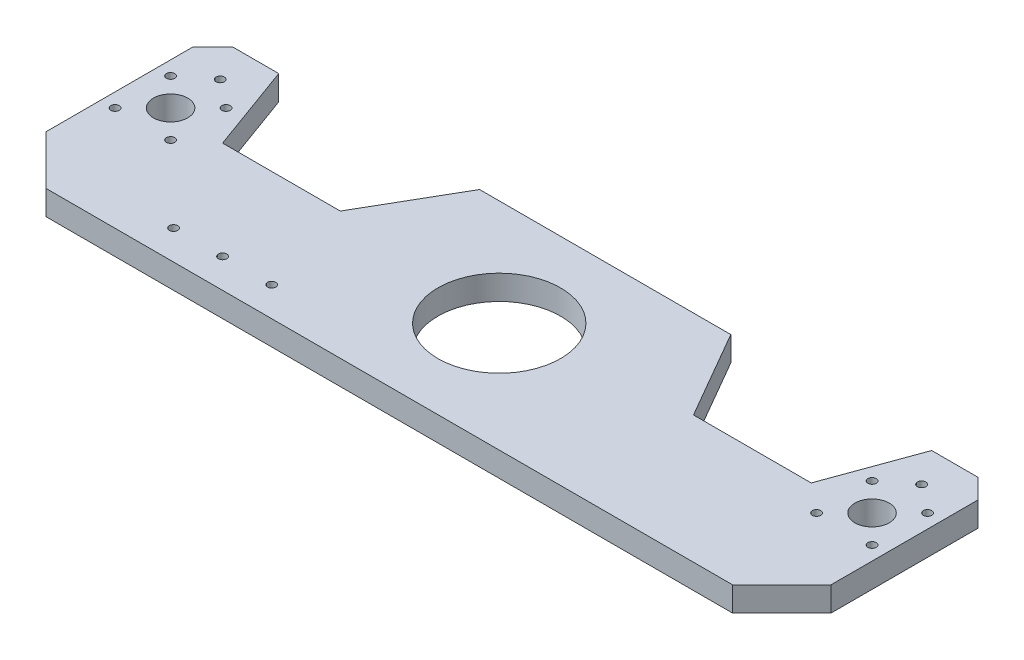
ISO-10303-21;
HEADER;
FILE_DESCRIPTION(('STEP AP214'),'2;1');
FILE_NAME('part.step','',(''),(''),'','','');
FILE_SCHEMA(('AUTOMOTIVE_DESIGN { 1 0 10303 214 1 1 1 1 }'));
ENDSEC;
DATA;
#1=APPLICATION_CONTEXT('core data for automotive mechanical design processes');
#2=APPLICATION_PROTOCOL_DEFINITION('international standard','automotive_design',2000,#1);
#3=PRODUCT_CONTEXT('',#1,'mechanical');
#4=PRODUCT('Part','Part','',(#3));
#5=PRODUCT_RELATED_PRODUCT_CATEGORY('part','',(#4));
#6=PRODUCT_DEFINITION_FORMATION('','',#4);
#7=PRODUCT_DEFINITION_CONTEXT('part definition',#1,'design');
#8=PRODUCT_DEFINITION('design','',#6,#7);
#9=PRODUCT_DEFINITION_SHAPE('','',#8);
#10=(LENGTH_UNIT() NAMED_UNIT(*) SI_UNIT(.MILLI.,.METRE.));
#11=(NAMED_UNIT(*) PLANE_ANGLE_UNIT() SI_UNIT($,.RADIAN.));
#12=(NAMED_UNIT(*) SI_UNIT($,.STERADIAN.) SOLID_ANGLE_UNIT());
#13=UNCERTAINTY_MEASURE_WITH_UNIT(LENGTH_MEASURE(1.E-05),#10,'distance_accuracy_value','');
#14=(GEOMETRIC_REPRESENTATION_CONTEXT(3) GLOBAL_UNCERTAINTY_ASSIGNED_CONTEXT((#13)) GLOBAL_UNIT_ASSIGNED_CONTEXT((#10,
#11,#12)) REPRESENTATION_CONTEXT('',''));
#15=CARTESIAN_POINT('',(0.,0.,0.));
#16=DIRECTION('',(0.,0.,1.));
#17=DIRECTION('',(1.,0.,0.));
#18=AXIS2_PLACEMENT_3D('',#15,#16,#17);
#19=CARTESIAN_POINT('',(-200.,25.,80.));
#20=DIRECTION('',(0.,1.,0.));
#21=DIRECTION('',(0.,0.,1.));
#22=AXIS2_PLACEMENT_3D('',#19,#20,#21);
#23=CYLINDRICAL_SURFACE('',#22,4.25);
#24=CARTESIAN_POINT('',(-200.,0.499999999988177,80.));
#25=DIRECTION('',(0.,1.,0.));
#26=DIRECTION('',(0.,0.,1.));
#27=AXIS2_PLACEMENT_3D('',#24,#25,#26);
#28=CIRCLE('',#27,4.25000000005411);
#29=CARTESIAN_POINT('',(-200.,0.499999999988177,84.2500000000541));
#30=VERTEX_POINT('',#29);
#31=EDGE_CURVE('E174',#30,#30,#28,.F.);
#32=ORIENTED_EDGE('',*,*,#31,.T.);
#33=EDGE_LOOP('',(#32));
#34=FACE_BOUND('',#33,.T.);
#35=CARTESIAN_POINT('',(-200.,25.,80.));
#36=DIRECTION('',(0.,1.,0.));
#37=DIRECTION('',(0.,0.,1.));
#38=AXIS2_PLACEMENT_3D('',#35,#36,#37);
#39=CIRCLE('',#38,4.25);
#40=CARTESIAN_POINT('',(-200.,25.,84.25));
#41=VERTEX_POINT('',#40);
#42=EDGE_CURVE('E20',#41,#41,#39,.T.);
#43=ORIENTED_EDGE('',*,*,#42,.T.);
#44=EDGE_LOOP('',(#43));
#45=FACE_BOUND('',#44,.T.);
#46=ADVANCED_FACE('F17',(#34,#45),#23,.F.);
#47=CARTESIAN_POINT('',(-250.,25.,80.));
#48=DIRECTION('',(0.,1.,0.));
#49=DIRECTION('',(0.,0.,1.));
#50=AXIS2_PLACEMENT_3D('',#47,#48,#49);
#51=CYLINDRICAL_SURFACE('',#50,4.25);
#52=CARTESIAN_POINT('',(-250.,0.499999999988177,80.));
#53=DIRECTION('',(0.,1.,0.));
#54=DIRECTION('',(0.,0.,1.));
#55=AXIS2_PLACEMENT_3D('',#52,#53,#54);
#56=CIRCLE('',#55,4.25000000005411);
#57=CARTESIAN_POINT('',(-250.,0.499999999988177,84.2500000000541));
#58=VERTEX_POINT('',#57);
#59=EDGE_CURVE('E170',#58,#58,#56,.F.);
#60=ORIENTED_EDGE('',*,*,#59,.T.);
#61=EDGE_LOOP('',(#60));
#62=FACE_BOUND('',#61,.T.);
#63=CARTESIAN_POINT('',(-250.,25.,80.));
#64=DIRECTION('',(0.,1.,0.));
#65=DIRECTION('',(0.,0.,1.));
#66=AXIS2_PLACEMENT_3D('',#63,#64,#65);
#67=CIRCLE('',#66,4.25);
#68=CARTESIAN_POINT('',(-250.,25.,84.25));
#69=VERTEX_POINT('',#68);
#70=EDGE_CURVE('E257',#69,#69,#67,.T.);
#71=ORIENTED_EDGE('',*,*,#70,.T.);
#72=EDGE_LOOP('',(#71));
#73=FACE_BOUND('',#72,.T.);
#74=ADVANCED_FACE('F421',(#62,#73),#51,.F.);
#75=CARTESIAN_POINT('',(357.500000705024,25.,-75.));
#76=DIRECTION('',(0.,1.,0.));
#77=DIRECTION('',(0.,0.,1.));
#78=AXIS2_PLACEMENT_3D('',#75,#76,#77);
#79=CYLINDRICAL_SURFACE('',#78,4.25);
#80=CARTESIAN_POINT('',(357.500000705024,0.499999999988177,-75.));
#81=DIRECTION('',(0.,1.,0.));
#82=DIRECTION('',(0.,0.,1.));
#83=AXIS2_PLACEMENT_3D('',#80,#81,#82);
#84=CIRCLE('',#83,4.25000000002457);
#85=CARTESIAN_POINT('',(357.500000705024,0.499999999988177,-70.7499999999754));
#86=VERTEX_POINT('',#85);
#87=EDGE_CURVE('E165',#86,#86,#84,.F.);
#88=ORIENTED_EDGE('',*,*,#87,.T.);
#89=EDGE_LOOP('',(#88));
#90=FACE_BOUND('',#89,.T.);
#91=CARTESIAN_POINT('',(357.500000705024,25.,-75.));
#92=DIRECTION('',(0.,1.,0.));
#93=DIRECTION('',(0.,0.,1.));
#94=AXIS2_PLACEMENT_3D('',#91,#92,#93);
#95=CIRCLE('',#94,4.25);
#96=CARTESIAN_POINT('',(357.500000705024,25.,-70.75));
#97=VERTEX_POINT('',#96);
#98=EDGE_CURVE('E255',#97,#97,#95,.T.);
#99=ORIENTED_EDGE('',*,*,#98,.T.);
#100=EDGE_LOOP('',(#99));
#101=FACE_BOUND('',#100,.T.);
#102=ADVANCED_FACE('F279',(#90,#101),#79,.F.);
#103=CARTESIAN_POINT('',(-357.499999294976,25.,-75.));
#104=DIRECTION('',(0.,1.,0.));
#105=DIRECTION('',(0.,0.,1.));
#106=AXIS2_PLACEMENT_3D('',#103,#104,#105);
#107=CYLINDRICAL_SURFACE('',#106,4.25);
#108=CARTESIAN_POINT('',(-357.499999294976,0.499999999988177,-75.));
#109=DIRECTION('',(0.,1.,0.));
#110=DIRECTION('',(0.,0.,1.));
#111=AXIS2_PLACEMENT_3D('',#108,#109,#110);
#112=CIRCLE('',#111,4.25000000002464);
#113=CARTESIAN_POINT('',(-357.499999294976,0.499999999988177,-70.7499999999754));
#114=VERTEX_POINT('',#113);
#115=EDGE_CURVE('E160',#114,#114,#112,.F.);
#116=ORIENTED_EDGE('',*,*,#115,.T.);
#117=EDGE_LOOP('',(#116));
#118=FACE_BOUND('',#117,.T.);
#119=CARTESIAN_POINT('',(-357.499999294976,25.,-75.));
#120=DIRECTION('',(0.,1.,0.));
#121=DIRECTION('',(0.,0.,1.));
#122=AXIS2_PLACEMENT_3D('',#119,#120,#121);
#123=CIRCLE('',#122,4.25);
#124=CARTESIAN_POINT('',(-357.499999294976,25.,-70.75));
#125=VERTEX_POINT('',#124);
#126=EDGE_CURVE('E252',#125,#125,#123,.T.);
#127=ORIENTED_EDGE('',*,*,#126,.T.);
#128=EDGE_LOOP('',(#127));
#129=FACE_BOUND('',#128,.T.);
#130=ADVANCED_FACE('F267',(#118,#129),#107,.F.);
#131=CARTESIAN_POINT('',(0.,25.,0.));
#132=DIRECTION('',(0.,-1.,0.));
#133=DIRECTION('',(0.,0.,-1.));
#134=AXIS2_PLACEMENT_3D('',#131,#132,#133);
#135=PLANE('',#134);
#136=CARTESIAN_POINT('',(-150.,25.,80.));
#137=DIRECTION('',(0.,1.,0.));
#138=DIRECTION('',(0.,0.,1.));
#139=AXIS2_PLACEMENT_3D('',#136,#137,#138);
#140=CIRCLE('',#139,4.25);
#141=CARTESIAN_POINT('',(-150.,25.,84.25));
#142=VERTEX_POINT('',#141);
#143=EDGE_CURVE('E176',#142,#142,#140,.F.);
#144=ORIENTED_EDGE('',*,*,#143,.T.);
#145=EDGE_LOOP('',(#144));
#146=FACE_BOUND('',#145,.T.);
#147=CARTESIAN_POINT('',(385.784271952485,25.,-52.7842712474622));
#148=DIRECTION('',(0.,1.,0.));
#149=DIRECTION('',(0.,0.,1.));
#150=AXIS2_PLACEMENT_3D('',#147,#148,#149);
#151=CIRCLE('',#150,4.25);
#152=CARTESIAN_POINT('',(385.784271952485,25.,-48.5342712474622));
#153=VERTEX_POINT('',#152);
#154=EDGE_CURVE('E173',#153,#153,#151,.F.);
#155=ORIENTED_EDGE('',*,*,#154,.T.);
#156=EDGE_LOOP('',(#155));
#157=FACE_BOUND('',#156,.T.);
#158=CARTESIAN_POINT('',(329.215729457562,25.,3.78427124746205));
#159=DIRECTION('',(0.,1.,0.));
#160=DIRECTION('',(0.,0.,1.));
#161=AXIS2_PLACEMENT_3D('',#158,#159,#160);
#162=CIRCLE('',#161,4.25);
#163=CARTESIAN_POINT('',(329.215729457562,25.,8.03427124746205));
#164=VERTEX_POINT('',#163);
#165=EDGE_CURVE('E242',#164,#164,#162,.F.);
#166=ORIENTED_EDGE('',*,*,#165,.T.);
#167=EDGE_LOOP('',(#166));
#168=FACE_BOUND('',#167,.T.);
#169=CARTESIAN_POINT('',(-329.215728047514,25.,-52.7842712474623));
#170=DIRECTION('',(0.,1.,0.));
#171=DIRECTION('',(0.,0.,1.));
#172=AXIS2_PLACEMENT_3D('',#169,#170,#171);
#173=CIRCLE('',#172,4.25);
#174=CARTESIAN_POINT('',(-329.215728047514,25.,-48.5342712474623));
#175=VERTEX_POINT('',#174);
#176=EDGE_CURVE('E235',#175,#175,#173,.F.);
#177=ORIENTED_EDGE('',*,*,#176,.T.);
#178=EDGE_LOOP('',(#177));
#179=FACE_BOUND('',#178,.T.);
#180=CARTESIAN_POINT('',(-385.784270542438,25.,3.784271247462));
#181=DIRECTION('',(0.,1.,0.));
#182=DIRECTION('',(0.,0.,1.));
#183=AXIS2_PLACEMENT_3D('',#180,#181,#182);
#184=CIRCLE('',#183,4.25);
#185=CARTESIAN_POINT('',(-385.784270542438,25.,8.034271247462));
#186=VERTEX_POINT('',#185);
#187=EDGE_CURVE('E229',#186,#186,#184,.F.);
#188=ORIENTED_EDGE('',*,*,#187,.T.);
#189=EDGE_LOOP('',(#188));
#190=FACE_BOUND('',#189,.T.);
#191=CARTESIAN_POINT('',(-385.784270542438,25.,-52.7842712474619));
#192=DIRECTION('',(0.,1.,0.));
#193=DIRECTION('',(0.,0.,1.));
#194=AXIS2_PLACEMENT_3D('',#191,#192,#193);
#195=CIRCLE('',#194,4.25);
#196=CARTESIAN_POINT('',(-385.784270542438,25.,-48.5342712474619));
#197=VERTEX_POINT('',#196);
#198=EDGE_CURVE('E164',#197,#197,#195,.F.);
#199=ORIENTED_EDGE('',*,*,#198,.T.);
#200=EDGE_LOOP('',(#199));
#201=FACE_BOUND('',#200,.T.);
#202=ORIENTED_EDGE('',*,*,#126,.F.);
#203=EDGE_LOOP('',(#202));
#204=FACE_BOUND('',#203,.T.);
#205=CARTESIAN_POINT('',(-357.499999294976,25.,-24.5));
#206=DIRECTION('',(0.,1.,0.));
#207=DIRECTION('',(0.,0.,1.));
#208=AXIS2_PLACEMENT_3D('',#205,#206,#207);
#209=CIRCLE('',#208,17.5);
#210=CARTESIAN_POINT('',(-357.499999294976,25.,-7.));
#211=VERTEX_POINT('',#210);
#212=EDGE_CURVE('E163',#211,#211,#209,.F.);
#213=ORIENTED_EDGE('',*,*,#212,.T.);
#214=EDGE_LOOP('',(#213));
#215=FACE_BOUND('',#214,.T.);
#216=CARTESIAN_POINT('',(0.,25.,-2.));
#217=DIRECTION('',(0.,1.,0.));
#218=DIRECTION('',(0.,0.,1.));
#219=AXIS2_PLACEMENT_3D('',#216,#217,#218);
#220=CIRCLE('',#219,62.5);
#221=CARTESIAN_POINT('',(0.,25.,60.5));
#222=VERTEX_POINT('',#221);
#223=EDGE_CURVE('E141',#222,#222,#220,.F.);
#224=ORIENTED_EDGE('',*,*,#223,.T.);
#225=EDGE_LOOP('',(#224));
#226=FACE_BOUND('',#225,.T.);
#227=DIRECTION('',(0.707106781186548,0.,0.707106781186548));
#228=VECTOR('',#227,1.);
#229=CARTESIAN_POINT('',(380.,25.,-110.));
#230=LINE('',#229,#228);
#231=CARTESIAN_POINT('',(400.,25.,-90.));
#232=VERTEX_POINT('',#231);
#233=CARTESIAN_POINT('',(380.,25.,-110.));
#234=VERTEX_POINT('',#233);
#235=EDGE_CURVE('E143',#232,#234,#230,.F.);
#236=ORIENTED_EDGE('',*,*,#235,.T.);
#237=DIRECTION('',(1.,0.,0.));
#238=VECTOR('',#237,1.);
#239=CARTESIAN_POINT('',(-400.,25.,-110.));
#240=LINE('',#239,#238);
#241=CARTESIAN_POINT('',(332.757321083958,25.,-110.));
#242=VERTEX_POINT('',#241);
#243=EDGE_CURVE('E133',#234,#242,#240,.F.);
#244=ORIENTED_EDGE('',*,*,#243,.T.);
#245=DIRECTION('',(0.342020143325665,0.,-0.93969262078591));
#246=VECTOR('',#245,1.);
#247=CARTESIAN_POINT('',(332.757321083958,25.,-110.));
#248=LINE('',#247,#246);
#249=CARTESIAN_POINT('',(300.,25.,-20.));
#250=VERTEX_POINT('',#249);
#251=EDGE_CURVE('E793',#242,#250,#248,.F.);
#252=ORIENTED_EDGE('',*,*,#251,.T.);
#253=DIRECTION('',(1.,0.,0.));
#254=VECTOR('',#253,1.);
#255=CARTESIAN_POINT('',(300.,25.,-20.));
#256=LINE('',#255,#254);
#257=CARTESIAN_POINT('',(180.,25.,-20.));
#258=VERTEX_POINT('',#257);
#259=EDGE_CURVE('E789',#250,#258,#256,.F.);
#260=ORIENTED_EDGE('',*,*,#259,.T.);
#261=DIRECTION('',(0.5,0.,0.86602540378444));
#262=VECTOR('',#261,1.);
#263=CARTESIAN_POINT('',(180.,25.,-19.9999999999993));
#264=LINE('',#263,#262);
#265=CARTESIAN_POINT('',(128.038475772934,25.,-110.));
#266=VERTEX_POINT('',#265);
#267=EDGE_CURVE('E783',#258,#266,#264,.F.);
#268=ORIENTED_EDGE('',*,*,#267,.T.);
#269=DIRECTION('',(1.,0.,0.));
#270=VECTOR('',#269,1.);
#271=CARTESIAN_POINT('',(-400.,25.,-110.));
#272=LINE('',#271,#270);
#273=CARTESIAN_POINT('',(-128.038475772934,25.,-110.));
#274=VERTEX_POINT('',#273);
#275=EDGE_CURVE('E780',#266,#274,#272,.F.);
#276=ORIENTED_EDGE('',*,*,#275,.T.);
#277=DIRECTION('',(0.5,0.,-0.86602540378444));
#278=VECTOR('',#277,1.);
#279=CARTESIAN_POINT('',(-128.038475772934,25.,-110.));
#280=LINE('',#279,#278);
#281=CARTESIAN_POINT('',(-180.,25.,-20.));
#282=VERTEX_POINT('',#281);
#283=EDGE_CURVE('E774',#274,#282,#280,.F.);
#284=ORIENTED_EDGE('',*,*,#283,.T.);
#285=DIRECTION('',(1.,0.,0.));
#286=VECTOR('',#285,1.);
#287=CARTESIAN_POINT('',(-300.,25.,-20.));
#288=LINE('',#287,#286);
#289=CARTESIAN_POINT('',(-300.,25.,-20.));
#290=VERTEX_POINT('',#289);
#291=EDGE_CURVE('E771',#282,#290,#288,.F.);
#292=ORIENTED_EDGE('',*,*,#291,.T.);
#293=DIRECTION('',(0.342020143325665,0.,0.93969262078591));
#294=VECTOR('',#293,1.);
#295=CARTESIAN_POINT('',(-300.,25.,-19.9999999999992));
#296=LINE('',#295,#294);
#297=CARTESIAN_POINT('',(-332.757321083958,25.,-110.));
#298=VERTEX_POINT('',#297);
#299=EDGE_CURVE('E765',#290,#298,#296,.F.);
#300=ORIENTED_EDGE('',*,*,#299,.T.);
#301=DIRECTION('',(1.,0.,0.));
#302=VECTOR('',#301,1.);
#303=CARTESIAN_POINT('',(-400.,25.,-110.));
#304=LINE('',#303,#302);
#305=CARTESIAN_POINT('',(-380.,25.,-110.));
#306=VERTEX_POINT('',#305);
#307=EDGE_CURVE('E761',#298,#306,#304,.F.);
#308=ORIENTED_EDGE('',*,*,#307,.T.);
#309=DIRECTION('',(0.70710678118655,0.,-0.707106781186546));
#310=VECTOR('',#309,1.);
#311=CARTESIAN_POINT('',(-400.,25.,-90.));
#312=LINE('',#311,#310);
#313=CARTESIAN_POINT('',(-400.,25.,-90.));
#314=VERTEX_POINT('',#313);
#315=EDGE_CURVE('E758',#306,#314,#312,.F.);
#316=ORIENTED_EDGE('',*,*,#315,.T.);
#317=DIRECTION('',(0.,0.,-1.));
#318=VECTOR('',#317,1.);
#319=CARTESIAN_POINT('',(-400.,25.,110.));
#320=LINE('',#319,#318);
#321=CARTESIAN_POINT('',(-400.,25.,60.));
#322=VERTEX_POINT('',#321);
#323=EDGE_CURVE('E753',#314,#322,#320,.F.);
#324=ORIENTED_EDGE('',*,*,#323,.T.);
#325=DIRECTION('',(-0.707106781186546,0.,-0.707106781186549));
#326=VECTOR('',#325,1.);
#327=CARTESIAN_POINT('',(-350.,25.,110.));
#328=LINE('',#327,#326);
#329=CARTESIAN_POINT('',(-350.,25.,110.));
#330=VERTEX_POINT('',#329);
#331=EDGE_CURVE('E748',#322,#330,#328,.F.);
#332=ORIENTED_EDGE('',*,*,#331,.T.);
#333=DIRECTION('',(-1.,0.,0.));
#334=VECTOR('',#333,1.);
#335=CARTESIAN_POINT('',(-400.,25.,110.));
#336=LINE('',#335,#334);
#337=CARTESIAN_POINT('',(350.,25.,110.));
#338=VERTEX_POINT('',#337);
#339=EDGE_CURVE('E742',#330,#338,#336,.F.);
#340=ORIENTED_EDGE('',*,*,#339,.T.);
#341=DIRECTION('',(-0.707106781186548,0.,0.707106781186547));
#342=VECTOR('',#341,1.);
#343=CARTESIAN_POINT('',(400.,25.,60.));
#344=LINE('',#343,#342);
#345=CARTESIAN_POINT('',(400.,25.,60.));
#346=VERTEX_POINT('',#345);
#347=EDGE_CURVE('E738',#338,#346,#344,.F.);
#348=ORIENTED_EDGE('',*,*,#347,.T.);
#349=DIRECTION('',(0.,0.,1.));
#350=VECTOR('',#349,1.);
#351=CARTESIAN_POINT('',(400.,25.,110.));
#352=LINE('',#351,#350);
#353=EDGE_CURVE('E128',#346,#232,#352,.F.);
#354=ORIENTED_EDGE('',*,*,#353,.T.);
#355=EDGE_LOOP('',(#236,#244,#252,#260,#268,#276,#284,#292,#300,#308,#316,#324,#332,#340,#348,#354));
#356=FACE_BOUND('',#355,.T.);
#357=CARTESIAN_POINT('',(-329.215728047514,25.,3.78427124746183));
#358=DIRECTION('',(0.,1.,0.));
#359=DIRECTION('',(0.,0.,1.));
#360=AXIS2_PLACEMENT_3D('',#357,#358,#359);
#361=CIRCLE('',#360,4.25);
#362=CARTESIAN_POINT('',(-329.215728047514,25.,8.03427124746183));
#363=VERTEX_POINT('',#362);
#364=EDGE_CURVE('E232',#363,#363,#361,.F.);
#365=ORIENTED_EDGE('',*,*,#364,.T.);
#366=EDGE_LOOP('',(#365));
#367=FACE_BOUND('',#366,.T.);
#368=CARTESIAN_POINT('',(357.500000705024,25.,-24.5));
#369=DIRECTION('',(0.,1.,0.));
#370=DIRECTION('',(0.,0.,1.));
#371=AXIS2_PLACEMENT_3D('',#368,#369,#370);
#372=CIRCLE('',#371,17.5);
#373=CARTESIAN_POINT('',(357.500000705024,25.,-7.));
#374=VERTEX_POINT('',#373);
#375=EDGE_CURVE('E168',#374,#374,#372,.F.);
#376=ORIENTED_EDGE('',*,*,#375,.T.);
#377=EDGE_LOOP('',(#376));
#378=FACE_BOUND('',#377,.T.);
#379=ORIENTED_EDGE('',*,*,#98,.F.);
#380=EDGE_LOOP('',(#379));
#381=FACE_BOUND('',#380,.T.);
#382=CARTESIAN_POINT('',(329.215729457562,25.,-52.7842712474618));
#383=DIRECTION('',(0.,1.,0.));
#384=DIRECTION('',(0.,0.,1.));
#385=AXIS2_PLACEMENT_3D('',#382,#383,#384);
#386=CIRCLE('',#385,4.25);
#387=CARTESIAN_POINT('',(329.215729457562,25.,-48.5342712474618));
#388=VERTEX_POINT('',#387);
#389=EDGE_CURVE('E169',#388,#388,#386,.F.);
#390=ORIENTED_EDGE('',*,*,#389,.T.);
#391=EDGE_LOOP('',(#390));
#392=FACE_BOUND('',#391,.T.);
#393=CARTESIAN_POINT('',(385.784271952486,25.,3.7842712474619));
#394=DIRECTION('',(0.,1.,0.));
#395=DIRECTION('',(0.,0.,1.));
#396=AXIS2_PLACEMENT_3D('',#393,#394,#395);
#397=CIRCLE('',#396,4.25);
#398=CARTESIAN_POINT('',(385.784271952486,25.,8.0342712474619));
#399=VERTEX_POINT('',#398);
#400=EDGE_CURVE('E245',#399,#399,#397,.F.);
#401=ORIENTED_EDGE('',*,*,#400,.T.);
#402=EDGE_LOOP('',(#401));
#403=FACE_BOUND('',#402,.T.);
#404=ORIENTED_EDGE('',*,*,#70,.F.);
#405=EDGE_LOOP('',(#404));
#406=FACE_BOUND('',#405,.T.);
#407=ORIENTED_EDGE('',*,*,#42,.F.);
#408=EDGE_LOOP('',(#407));
#409=FACE_BOUND('',#408,.T.);
#410=ADVANCED_FACE('F144',(#146,#157,#168,#179,#190,#201,#204,#215,#226,#356,#367,#378,#381,
#392,#403,#406,#409),#135,.F.);
#411=CARTESIAN_POINT('',(-150.,25.,80.));
#412=DIRECTION('',(0.,1.,0.));
#413=DIRECTION('',(0.,0.,1.));
#414=AXIS2_PLACEMENT_3D('',#411,#412,#413);
#415=CYLINDRICAL_SURFACE('',#414,4.25);
#416=CARTESIAN_POINT('',(-150.,0.499999999988177,80.));
#417=DIRECTION('',(0.,1.,0.));
#418=DIRECTION('',(0.,0.,1.));
#419=AXIS2_PLACEMENT_3D('',#416,#417,#418);
#420=CIRCLE('',#419,4.25000000005411);
#421=CARTESIAN_POINT('',(-150.,0.499999999988177,84.2500000000541));
#422=VERTEX_POINT('',#421);
#423=EDGE_CURVE('E156',#422,#422,#420,.F.);
#424=ORIENTED_EDGE('',*,*,#423,.T.);
#425=EDGE_LOOP('',(#424));
#426=FACE_BOUND('',#425,.T.);
#427=ORIENTED_EDGE('',*,*,#143,.F.);
#428=EDGE_LOOP('',(#427));
#429=FACE_BOUND('',#428,.T.);
#430=ADVANCED_FACE('F266',(#426,#429),#415,.F.);
#431=CARTESIAN_POINT('',(-200.,0.499999999988177,80.));
#432=DIRECTION('',(0.,1.,0.));
#433=DIRECTION('',(0.,0.,1.));
#434=AXIS2_PLACEMENT_3D('',#431,#432,#433);
#435=CONICAL_SURFACE('',#434,4.25000000005411,1.02974425867589);
#436=CARTESIAN_POINT('',(-200.,-8.14340999147345E-11,80.));
#437=DIRECTION('',(0.,1.,0.));
#438=DIRECTION('',(0.,0.,1.));
#439=AXIS2_PLACEMENT_3D('',#436,#437,#438);
#440=CIRCLE('',#439,3.41786025876445);
#441=CARTESIAN_POINT('',(-200.,-8.14340999147345E-11,83.4178602587644));
#442=VERTEX_POINT('',#441);
#443=EDGE_CURVE('E159',#442,#442,#440,.T.);
#444=ORIENTED_EDGE('',*,*,#443,.F.);
#445=EDGE_LOOP('',(#444));
#446=FACE_BOUND('',#445,.T.);
#447=ORIENTED_EDGE('',*,*,#31,.F.);
#448=EDGE_LOOP('',(#447));
#449=FACE_BOUND('',#448,.T.);
#450=ADVANCED_FACE('F276',(#446,#449),#435,.F.);
#451=CARTESIAN_POINT('',(-250.,0.499999999988177,80.));
#452=DIRECTION('',(0.,1.,0.));
#453=DIRECTION('',(0.,0.,1.));
#454=AXIS2_PLACEMENT_3D('',#451,#452,#453);
#455=CONICAL_SURFACE('',#454,4.25000000005411,1.02974425867589);
#456=CARTESIAN_POINT('',(-250.,-8.14340999147345E-11,80.));
#457=DIRECTION('',(0.,1.,0.));
#458=DIRECTION('',(0.,0.,1.));
#459=AXIS2_PLACEMENT_3D('',#456,#457,#458);
#460=CIRCLE('',#459,3.41786025876445);
#461=CARTESIAN_POINT('',(-250.,-8.14340999147345E-11,83.4178602587644));
#462=VERTEX_POINT('',#461);
#463=EDGE_CURVE('E218',#462,#462,#460,.T.);
#464=ORIENTED_EDGE('',*,*,#463,.F.);
#465=EDGE_LOOP('',(#464));
#466=FACE_BOUND('',#465,.T.);
#467=ORIENTED_EDGE('',*,*,#59,.F.);
#468=EDGE_LOOP('',(#467));
#469=FACE_BOUND('',#468,.T.);
#470=ADVANCED_FACE('F406',(#466,#469),#455,.F.);
#471=CARTESIAN_POINT('',(385.784271952485,25.,-52.7842712474622));
#472=DIRECTION('',(0.,1.,0.));
#473=DIRECTION('',(0.,0.,1.));
#474=AXIS2_PLACEMENT_3D('',#471,#472,#473);
#475=CYLINDRICAL_SURFACE('',#474,4.25);
#476=ORIENTED_EDGE('',*,*,#154,.F.);
#477=EDGE_LOOP('',(#476));
#478=FACE_BOUND('',#477,.T.);
#479=CARTESIAN_POINT('',(385.784271952485,0.,-52.7842712474622));
#480=DIRECTION('',(0.,1.,0.));
#481=DIRECTION('',(0.,0.,1.));
#482=AXIS2_PLACEMENT_3D('',#479,#480,#481);
#483=CIRCLE('',#482,4.25);
#484=CARTESIAN_POINT('',(385.784271952485,0.,-48.5342712474622));
#485=VERTEX_POINT('',#484);
#486=EDGE_CURVE('E215',#485,#485,#483,.T.);
#487=ORIENTED_EDGE('',*,*,#486,.F.);
#488=EDGE_LOOP('',(#487));
#489=FACE_BOUND('',#488,.T.);
#490=ADVANCED_FACE('F402',(#478,#489),#475,.F.);
#491=CARTESIAN_POINT('',(385.784271952486,25.,3.7842712474619));
#492=DIRECTION('',(0.,1.,0.));
#493=DIRECTION('',(0.,0.,1.));
#494=AXIS2_PLACEMENT_3D('',#491,#492,#493);
#495=CYLINDRICAL_SURFACE('',#494,4.25);
#496=ORIENTED_EDGE('',*,*,#400,.F.);
#497=EDGE_LOOP('',(#496));
#498=FACE_BOUND('',#497,.T.);
#499=CARTESIAN_POINT('',(385.784271952486,0.,3.7842712474619));
#500=DIRECTION('',(0.,1.,0.));
#501=DIRECTION('',(0.,0.,1.));
#502=AXIS2_PLACEMENT_3D('',#499,#500,#501);
#503=CIRCLE('',#502,4.25);
#504=CARTESIAN_POINT('',(385.784271952486,0.,8.0342712474619));
#505=VERTEX_POINT('',#504);
#506=EDGE_CURVE('E212',#505,#505,#503,.T.);
#507=ORIENTED_EDGE('',*,*,#506,.F.);
#508=EDGE_LOOP('',(#507));
#509=FACE_BOUND('',#508,.T.);
#510=ADVANCED_FACE('F398',(#498,#509),#495,.F.);
#511=CARTESIAN_POINT('',(329.215729457562,25.,3.78427124746205));
#512=DIRECTION('',(0.,1.,0.));
#513=DIRECTION('',(0.,0.,1.));
#514=AXIS2_PLACEMENT_3D('',#511,#512,#513);
#515=CYLINDRICAL_SURFACE('',#514,4.25);
#516=ORIENTED_EDGE('',*,*,#165,.F.);
#517=EDGE_LOOP('',(#516));
#518=FACE_BOUND('',#517,.T.);
#519=CARTESIAN_POINT('',(329.215729457562,0.,3.78427124746205));
#520=DIRECTION('',(0.,1.,0.));
#521=DIRECTION('',(0.,0.,1.));
#522=AXIS2_PLACEMENT_3D('',#519,#520,#521);
#523=CIRCLE('',#522,4.25);
#524=CARTESIAN_POINT('',(329.215729457562,0.,8.03427124746205));
#525=VERTEX_POINT('',#524);
#526=EDGE_CURVE('E209',#525,#525,#523,.T.);
#527=ORIENTED_EDGE('',*,*,#526,.F.);
#528=EDGE_LOOP('',(#527));
#529=FACE_BOUND('',#528,.T.);
#530=ADVANCED_FACE('F394',(#518,#529),#515,.F.);
#531=CARTESIAN_POINT('',(329.215729457562,25.,-52.7842712474618));
#532=DIRECTION('',(0.,1.,0.));
#533=DIRECTION('',(0.,0.,1.));
#534=AXIS2_PLACEMENT_3D('',#531,#532,#533);
#535=CYLINDRICAL_SURFACE('',#534,4.25);
#536=ORIENTED_EDGE('',*,*,#389,.F.);
#537=EDGE_LOOP('',(#536));
#538=FACE_BOUND('',#537,.T.);
#539=CARTESIAN_POINT('',(329.215729457562,0.,-52.7842712474618));
#540=DIRECTION('',(0.,1.,0.));
#541=DIRECTION('',(0.,0.,1.));
#542=AXIS2_PLACEMENT_3D('',#539,#540,#541);
#543=CIRCLE('',#542,4.25);
#544=CARTESIAN_POINT('',(329.215729457562,0.,-48.5342712474618));
#545=VERTEX_POINT('',#544);
#546=EDGE_CURVE('E206',#545,#545,#543,.T.);
#547=ORIENTED_EDGE('',*,*,#546,.F.);
#548=EDGE_LOOP('',(#547));
#549=FACE_BOUND('',#548,.T.);
#550=ADVANCED_FACE('F390',(#538,#549),#535,.F.);
#551=CARTESIAN_POINT('',(357.500000705024,0.499999999931333,-75.));
#552=DIRECTION('',(0.,1.,0.));
#553=DIRECTION('',(0.,0.,1.));
#554=AXIS2_PLACEMENT_3D('',#551,#552,#553);
#555=CONICAL_SURFACE('',#554,4.24999999991088,1.02974425866576);
#556=CARTESIAN_POINT('',(357.500000705024,4.62889275520961E-12,-75.));
#557=DIRECTION('',(0.,1.,0.));
#558=DIRECTION('',(0.,0.,1.));
#559=AXIS2_PLACEMENT_3D('',#556,#557,#558);
#560=CIRCLE('',#559,3.41786025887814);
#561=CARTESIAN_POINT('',(357.500000705024,4.62889275520961E-12,-71.5821397411219));
#562=VERTEX_POINT('',#561);
#563=EDGE_CURVE('E203',#562,#562,#560,.T.);
#564=ORIENTED_EDGE('',*,*,#563,.F.);
#565=EDGE_LOOP('',(#564));
#566=FACE_BOUND('',#565,.T.);
#567=ORIENTED_EDGE('',*,*,#87,.F.);
#568=EDGE_LOOP('',(#567));
#569=FACE_BOUND('',#568,.T.);
#570=ADVANCED_FACE('F386',(#566,#569),#555,.F.);
#571=CARTESIAN_POINT('',(357.500000705024,0.,-24.5));
#572=DIRECTION('',(0.,1.,0.));
#573=DIRECTION('',(0.,0.,1.));
#574=AXIS2_PLACEMENT_3D('',#571,#572,#573);
#575=CYLINDRICAL_SURFACE('',#574,17.5);
#576=ORIENTED_EDGE('',*,*,#375,.F.);
#577=EDGE_LOOP('',(#576));
#578=FACE_BOUND('',#577,.T.);
#579=CARTESIAN_POINT('',(357.500000705024,0.,-24.5));
#580=DIRECTION('',(0.,1.,0.));
#581=DIRECTION('',(0.,0.,1.));
#582=AXIS2_PLACEMENT_3D('',#579,#580,#581);
#583=CIRCLE('',#582,17.5);
#584=CARTESIAN_POINT('',(357.500000705024,0.,-7.));
#585=VERTEX_POINT('',#584);
#586=EDGE_CURVE('E200',#585,#585,#583,.T.);
#587=ORIENTED_EDGE('',*,*,#586,.F.);
#588=EDGE_LOOP('',(#587));
#589=FACE_BOUND('',#588,.T.);
#590=ADVANCED_FACE('F382',(#578,#589),#575,.F.);
#591=CARTESIAN_POINT('',(-329.215728047514,25.,-52.7842712474623));
#592=DIRECTION('',(0.,1.,0.));
#593=DIRECTION('',(0.,0.,1.));
#594=AXIS2_PLACEMENT_3D('',#591,#592,#593);
#595=CYLINDRICAL_SURFACE('',#594,4.25);
#596=ORIENTED_EDGE('',*,*,#176,.F.);
#597=EDGE_LOOP('',(#596));
#598=FACE_BOUND('',#597,.T.);
#599=CARTESIAN_POINT('',(-329.215728047514,0.,-52.7842712474623));
#600=DIRECTION('',(0.,1.,0.));
#601=DIRECTION('',(0.,0.,1.));
#602=AXIS2_PLACEMENT_3D('',#599,#600,#601);
#603=CIRCLE('',#602,4.25);
#604=CARTESIAN_POINT('',(-329.215728047514,0.,-48.5342712474623));
#605=VERTEX_POINT('',#604);
#606=EDGE_CURVE('E197',#605,#605,#603,.T.);
#607=ORIENTED_EDGE('',*,*,#606,.F.);
#608=EDGE_LOOP('',(#607));
#609=FACE_BOUND('',#608,.T.);
#610=ADVANCED_FACE('F378',(#598,#609),#595,.F.);
#611=CARTESIAN_POINT('',(-329.215728047514,25.,3.78427124746183));
#612=DIRECTION('',(0.,1.,0.));
#613=DIRECTION('',(0.,0.,1.));
#614=AXIS2_PLACEMENT_3D('',#611,#612,#613);
#615=CYLINDRICAL_SURFACE('',#614,4.25);
#616=ORIENTED_EDGE('',*,*,#364,.F.);
#617=EDGE_LOOP('',(#616));
#618=FACE_BOUND('',#617,.T.);
#619=CARTESIAN_POINT('',(-329.215728047514,0.,3.78427124746183));
#620=DIRECTION('',(0.,1.,0.));
#621=DIRECTION('',(0.,0.,1.));
#622=AXIS2_PLACEMENT_3D('',#619,#620,#621);
#623=CIRCLE('',#622,4.25);
#624=CARTESIAN_POINT('',(-329.215728047514,0.,8.03427124746183));
#625=VERTEX_POINT('',#624);
#626=EDGE_CURVE('E194',#625,#625,#623,.T.);
#627=ORIENTED_EDGE('',*,*,#626,.F.);
#628=EDGE_LOOP('',(#627));
#629=FACE_BOUND('',#628,.T.);
#630=ADVANCED_FACE('F374',(#618,#629),#615,.F.);
#631=CARTESIAN_POINT('',(-385.784270542438,25.,3.784271247462));
#632=DIRECTION('',(0.,1.,0.));
#633=DIRECTION('',(0.,0.,1.));
#634=AXIS2_PLACEMENT_3D('',#631,#632,#633);
#635=CYLINDRICAL_SURFACE('',#634,4.25);
#636=ORIENTED_EDGE('',*,*,#187,.F.);
#637=EDGE_LOOP('',(#636));
#638=FACE_BOUND('',#637,.T.);
#639=CARTESIAN_POINT('',(-385.784270542438,0.,3.784271247462));
#640=DIRECTION('',(0.,1.,0.));
#641=DIRECTION('',(0.,0.,1.));
#642=AXIS2_PLACEMENT_3D('',#639,#640,#641);
#643=CIRCLE('',#642,4.25);
#644=CARTESIAN_POINT('',(-385.784270542438,0.,8.034271247462));
#645=VERTEX_POINT('',#644);
#646=EDGE_CURVE('E191',#645,#645,#643,.T.);
#647=ORIENTED_EDGE('',*,*,#646,.F.);
#648=EDGE_LOOP('',(#647));
#649=FACE_BOUND('',#648,.T.);
#650=ADVANCED_FACE('F370',(#638,#649),#635,.F.);
#651=CARTESIAN_POINT('',(-385.784270542438,25.,-52.7842712474619));
#652=DIRECTION('',(0.,1.,0.));
#653=DIRECTION('',(0.,0.,1.));
#654=AXIS2_PLACEMENT_3D('',#651,#652,#653);
#655=CYLINDRICAL_SURFACE('',#654,4.25);
#656=ORIENTED_EDGE('',*,*,#198,.F.);
#657=EDGE_LOOP('',(#656));
#658=FACE_BOUND('',#657,.T.);
#659=CARTESIAN_POINT('',(-385.784270542438,0.,-52.7842712474619));
#660=DIRECTION('',(0.,1.,0.));
#661=DIRECTION('',(0.,0.,1.));
#662=AXIS2_PLACEMENT_3D('',#659,#660,#661);
#663=CIRCLE('',#662,4.25);
#664=CARTESIAN_POINT('',(-385.784270542438,0.,-48.5342712474619));
#665=VERTEX_POINT('',#664);
#666=EDGE_CURVE('E188',#665,#665,#663,.T.);
#667=ORIENTED_EDGE('',*,*,#666,.F.);
#668=EDGE_LOOP('',(#667));
#669=FACE_BOUND('',#668,.T.);
#670=ADVANCED_FACE('F366',(#658,#669),#655,.F.);
#671=CARTESIAN_POINT('',(-357.499999294976,0.499999999931333,-75.));
#672=DIRECTION('',(0.,1.,0.));
#673=DIRECTION('',(0.,0.,1.));
#674=AXIS2_PLACEMENT_3D('',#671,#672,#673);
#675=CONICAL_SURFACE('',#674,4.24999999991095,1.02974425866576);
#676=CARTESIAN_POINT('',(-357.499999294976,4.58715097156892E-12,-75.));
#677=DIRECTION('',(0.,1.,0.));
#678=DIRECTION('',(0.,0.,1.));
#679=AXIS2_PLACEMENT_3D('',#676,#677,#678);
#680=CIRCLE('',#679,3.41786025887814);
#681=CARTESIAN_POINT('',(-357.499999294976,4.58715097156892E-12,-71.5821397411219));
#682=VERTEX_POINT('',#681);
#683=EDGE_CURVE('E185',#682,#682,#680,.T.);
#684=ORIENTED_EDGE('',*,*,#683,.F.);
#685=EDGE_LOOP('',(#684));
#686=FACE_BOUND('',#685,.T.);
#687=ORIENTED_EDGE('',*,*,#115,.F.);
#688=EDGE_LOOP('',(#687));
#689=FACE_BOUND('',#688,.T.);
#690=ADVANCED_FACE('F362',(#686,#689),#675,.F.);
#691=CARTESIAN_POINT('',(-357.499999294976,0.,-24.5));
#692=DIRECTION('',(0.,1.,0.));
#693=DIRECTION('',(0.,0.,1.));
#694=AXIS2_PLACEMENT_3D('',#691,#692,#693);
#695=CYLINDRICAL_SURFACE('',#694,17.5);
#696=ORIENTED_EDGE('',*,*,#212,.F.);
#697=EDGE_LOOP('',(#696));
#698=FACE_BOUND('',#697,.T.);
#699=CARTESIAN_POINT('',(-357.499999294976,0.,-24.5));
#700=DIRECTION('',(0.,1.,0.));
#701=DIRECTION('',(0.,0.,1.));
#702=AXIS2_PLACEMENT_3D('',#699,#700,#701);
#703=CIRCLE('',#702,17.5);
#704=CARTESIAN_POINT('',(-357.499999294976,0.,-7.));
#705=VERTEX_POINT('',#704);
#706=EDGE_CURVE('E182',#705,#705,#703,.T.);
#707=ORIENTED_EDGE('',*,*,#706,.F.);
#708=EDGE_LOOP('',(#707));
#709=FACE_BOUND('',#708,.T.);
#710=ADVANCED_FACE('F358',(#698,#709),#695,.F.);
#711=CARTESIAN_POINT('',(0.,0.,-2.));
#712=DIRECTION('',(0.,1.,0.));
#713=DIRECTION('',(0.,0.,1.));
#714=AXIS2_PLACEMENT_3D('',#711,#712,#713);
#715=CYLINDRICAL_SURFACE('',#714,62.5);
#716=ORIENTED_EDGE('',*,*,#223,.F.);
#717=EDGE_LOOP('',(#716));
#718=FACE_BOUND('',#717,.T.);
#719=CARTESIAN_POINT('',(0.,0.,-2.));
#720=DIRECTION('',(0.,1.,0.));
#721=DIRECTION('',(0.,0.,1.));
#722=AXIS2_PLACEMENT_3D('',#719,#720,#721);
#723=CIRCLE('',#722,62.5);
#724=CARTESIAN_POINT('',(0.,0.,60.5));
#725=VERTEX_POINT('',#724);
#726=EDGE_CURVE('E178',#725,#725,#723,.T.);
#727=ORIENTED_EDGE('',*,*,#726,.F.);
#728=EDGE_LOOP('',(#727));
#729=FACE_BOUND('',#728,.T.);
#730=ADVANCED_FACE('F355',(#718,#729),#715,.F.);
#731=CARTESIAN_POINT('',(-400.,25.,-110.));
#732=DIRECTION('',(0.,0.,1.));
#733=DIRECTION('',(1.,0.,0.));
#734=AXIS2_PLACEMENT_3D('',#731,#732,#733);
#735=PLANE('',#734);
#736=DIRECTION('',(0.,1.,0.));
#737=VECTOR('',#736,1.);
#738=CARTESIAN_POINT('',(380.,25.,-110.));
#739=LINE('',#738,#737);
#740=CARTESIAN_POINT('',(380.,0.,-110.));
#741=VERTEX_POINT('',#740);
#742=EDGE_CURVE('E136',#234,#741,#739,.F.);
#743=ORIENTED_EDGE('',*,*,#742,.T.);
#744=DIRECTION('',(1.,0.,0.));
#745=VECTOR('',#744,1.);
#746=CARTESIAN_POINT('',(0.,0.,-110.));
#747=LINE('',#746,#745);
#748=CARTESIAN_POINT('',(332.757321083958,0.,-110.));
#749=VERTEX_POINT('',#748);
#750=EDGE_CURVE('E181',#749,#741,#747,.T.);
#751=ORIENTED_EDGE('',*,*,#750,.F.);
#752=DIRECTION('',(0.,1.,0.));
#753=VECTOR('',#752,1.);
#754=CARTESIAN_POINT('',(332.757321083958,25.,-110.));
#755=LINE('',#754,#753);
#756=EDGE_CURVE('E139',#749,#242,#755,.T.);
#757=ORIENTED_EDGE('',*,*,#756,.T.);
#758=ORIENTED_EDGE('',*,*,#243,.F.);
#759=EDGE_LOOP('',(#743,#751,#757,#758));
#760=FACE_BOUND('',#759,.T.);
#761=ADVANCED_FACE('F134',(#760),#735,.F.);
#762=CARTESIAN_POINT('',(380.,25.,-110.));
#763=DIRECTION('',(-0.707106781186548,0.,0.707106781186548));
#764=DIRECTION('',(0.707106781186548,0.,0.707106781186548));
#765=AXIS2_PLACEMENT_3D('',#762,#763,#764);
#766=PLANE('',#765);
#767=DIRECTION('',(0.,1.,0.));
#768=VECTOR('',#767,1.);
#769=CARTESIAN_POINT('',(400.,25.,-90.));
#770=LINE('',#769,#768);
#771=CARTESIAN_POINT('',(400.,0.,-90.));
#772=VERTEX_POINT('',#771);
#773=EDGE_CURVE('E733',#232,#772,#770,.F.);
#774=ORIENTED_EDGE('',*,*,#773,.T.);
#775=DIRECTION('',(0.707106781186551,0.,0.707106781186544));
#776=VECTOR('',#775,1.);
#777=CARTESIAN_POINT('',(380.,0.,-110.));
#778=LINE('',#777,#776);
#779=EDGE_CURVE('E151',#741,#772,#778,.T.);
#780=ORIENTED_EDGE('',*,*,#779,.F.);
#781=ORIENTED_EDGE('',*,*,#742,.F.);
#782=ORIENTED_EDGE('',*,*,#235,.F.);
#783=EDGE_LOOP('',(#774,#780,#781,#782));
#784=FACE_BOUND('',#783,.T.);
#785=ADVANCED_FACE('F149',(#784),#766,.F.);
#786=CARTESIAN_POINT('',(400.,25.,110.));
#787=DIRECTION('',(-1.,0.,0.));
#788=DIRECTION('',(0.,0.,1.));
#789=AXIS2_PLACEMENT_3D('',#786,#787,#788);
#790=PLANE('',#789);
#791=ORIENTED_EDGE('',*,*,#773,.F.);
#792=ORIENTED_EDGE('',*,*,#353,.F.);
#793=DIRECTION('',(0.,1.,0.));
#794=VECTOR('',#793,1.);
#795=CARTESIAN_POINT('',(400.,25.,60.));
#796=LINE('',#795,#794);
#797=CARTESIAN_POINT('',(400.,0.,60.));
#798=VERTEX_POINT('',#797);
#799=EDGE_CURVE('E736',#346,#798,#796,.F.);
#800=ORIENTED_EDGE('',*,*,#799,.T.);
#801=DIRECTION('',(0.,0.,-1.));
#802=VECTOR('',#801,1.);
#803=CARTESIAN_POINT('',(400.,0.,0.));
#804=LINE('',#803,#802);
#805=EDGE_CURVE('E735',#772,#798,#804,.F.);
#806=ORIENTED_EDGE('',*,*,#805,.F.);
#807=EDGE_LOOP('',(#791,#792,#800,#806));
#808=FACE_BOUND('',#807,.T.);
#809=ADVANCED_FACE('F346',(#808),#790,.F.);
#810=CARTESIAN_POINT('',(400.,25.,60.));
#811=DIRECTION('',(-0.707106781186547,0.,-0.707106781186548));
#812=DIRECTION('',(-0.707106781186548,0.,0.707106781186547));
#813=AXIS2_PLACEMENT_3D('',#810,#811,#812);
#814=PLANE('',#813);
#815=DIRECTION('',(0.,1.,0.));
#816=VECTOR('',#815,1.);
#817=CARTESIAN_POINT('',(350.,25.,110.));
#818=LINE('',#817,#816);
#819=CARTESIAN_POINT('',(350.,0.,110.));
#820=VERTEX_POINT('',#819);
#821=EDGE_CURVE('E744',#338,#820,#818,.F.);
#822=ORIENTED_EDGE('',*,*,#821,.T.);
#823=DIRECTION('',(-0.707106781186548,0.,0.707106781186547));
#824=VECTOR('',#823,1.);
#825=CARTESIAN_POINT('',(400.,0.,60.));
#826=LINE('',#825,#824);
#827=EDGE_CURVE('E799',#798,#820,#826,.T.);
#828=ORIENTED_EDGE('',*,*,#827,.F.);
#829=ORIENTED_EDGE('',*,*,#799,.F.);
#830=ORIENTED_EDGE('',*,*,#347,.F.);
#831=EDGE_LOOP('',(#822,#828,#829,#830));
#832=FACE_BOUND('',#831,.T.);
#833=ADVANCED_FACE('F342',(#832),#814,.F.);
#834=CARTESIAN_POINT('',(-400.,25.,110.));
#835=DIRECTION('',(0.,0.,-1.));
#836=DIRECTION('',(-1.,0.,0.));
#837=AXIS2_PLACEMENT_3D('',#834,#835,#836);
#838=PLANE('',#837);
#839=ORIENTED_EDGE('',*,*,#821,.F.);
#840=ORIENTED_EDGE('',*,*,#339,.F.);
#841=DIRECTION('',(0.,1.,0.));
#842=VECTOR('',#841,1.);
#843=CARTESIAN_POINT('',(-350.,25.,110.));
#844=LINE('',#843,#842);
#845=CARTESIAN_POINT('',(-350.,0.,110.));
#846=VERTEX_POINT('',#845);
#847=EDGE_CURVE('E746',#330,#846,#844,.F.);
#848=ORIENTED_EDGE('',*,*,#847,.T.);
#849=DIRECTION('',(1.,0.,0.));
#850=VECTOR('',#849,1.);
#851=CARTESIAN_POINT('',(0.,0.,110.));
#852=LINE('',#851,#850);
#853=EDGE_CURVE('E802',#820,#846,#852,.F.);
#854=ORIENTED_EDGE('',*,*,#853,.F.);
#855=EDGE_LOOP('',(#839,#840,#848,#854));
#856=FACE_BOUND('',#855,.T.);
#857=ADVANCED_FACE('F338',(#856),#838,.F.);
#858=CARTESIAN_POINT('',(-350.,25.,110.));
#859=DIRECTION('',(0.707106781186549,0.,-0.707106781186546));
#860=DIRECTION('',(-0.707106781186546,0.,-0.707106781186549));
#861=AXIS2_PLACEMENT_3D('',#858,#859,#860);
#862=PLANE('',#861);
#863=DIRECTION('',(0.,1.,0.));
#864=VECTOR('',#863,1.);
#865=CARTESIAN_POINT('',(-400.,25.,60.));
#866=LINE('',#865,#864);
#867=CARTESIAN_POINT('',(-400.,0.,60.));
#868=VERTEX_POINT('',#867);
#869=EDGE_CURVE('E751',#322,#868,#866,.F.);
#870=ORIENTED_EDGE('',*,*,#869,.T.);
#871=DIRECTION('',(-0.707106781186546,0.,-0.707106781186549));
#872=VECTOR('',#871,1.);
#873=CARTESIAN_POINT('',(-350.,0.,110.));
#874=LINE('',#873,#872);
#875=EDGE_CURVE('E805',#846,#868,#874,.T.);
#876=ORIENTED_EDGE('',*,*,#875,.F.);
#877=ORIENTED_EDGE('',*,*,#847,.F.);
#878=ORIENTED_EDGE('',*,*,#331,.F.);
#879=EDGE_LOOP('',(#870,#876,#877,#878));
#880=FACE_BOUND('',#879,.T.);
#881=ADVANCED_FACE('F334',(#880),#862,.F.);
#882=CARTESIAN_POINT('',(-400.,25.,110.));
#883=DIRECTION('',(1.,0.,0.));
#884=DIRECTION('',(0.,0.,-1.));
#885=AXIS2_PLACEMENT_3D('',#882,#883,#884);
#886=PLANE('',#885);
#887=DIRECTION('',(0.,1.,0.));
#888=VECTOR('',#887,1.);
#889=CARTESIAN_POINT('',(-400.,25.,-90.));
#890=LINE('',#889,#888);
#891=CARTESIAN_POINT('',(-400.,0.,-90.));
#892=VERTEX_POINT('',#891);
#893=EDGE_CURVE('E756',#314,#892,#890,.F.);
#894=ORIENTED_EDGE('',*,*,#893,.T.);
#895=DIRECTION('',(0.,0.,-1.));
#896=VECTOR('',#895,1.);
#897=CARTESIAN_POINT('',(-400.,0.,0.));
#898=LINE('',#897,#896);
#899=EDGE_CURVE('E808',#868,#892,#898,.T.);
#900=ORIENTED_EDGE('',*,*,#899,.F.);
#901=ORIENTED_EDGE('',*,*,#869,.F.);
#902=ORIENTED_EDGE('',*,*,#323,.F.);
#903=EDGE_LOOP('',(#894,#900,#901,#902));
#904=FACE_BOUND('',#903,.T.);
#905=ADVANCED_FACE('F330',(#904),#886,.F.);
#906=CARTESIAN_POINT('',(-400.,25.,-90.));
#907=DIRECTION('',(0.707106781186546,0.,0.70710678118655));
#908=DIRECTION('',(0.70710678118655,0.,-0.707106781186546));
#909=AXIS2_PLACEMENT_3D('',#906,#907,#908);
#910=PLANE('',#909);
#911=DIRECTION('',(0.,1.,0.));
#912=VECTOR('',#911,1.);
#913=CARTESIAN_POINT('',(-380.,25.,-110.));
#914=LINE('',#913,#912);
#915=CARTESIAN_POINT('',(-380.,0.,-110.));
#916=VERTEX_POINT('',#915);
#917=EDGE_CURVE('E763',#306,#916,#914,.F.);
#918=ORIENTED_EDGE('',*,*,#917,.T.);
#919=DIRECTION('',(0.70710678118655,0.,-0.707106781186545));
#920=VECTOR('',#919,1.);
#921=CARTESIAN_POINT('',(-400.,0.,-90.));
#922=LINE('',#921,#920);
#923=EDGE_CURVE('E811',#892,#916,#922,.T.);
#924=ORIENTED_EDGE('',*,*,#923,.F.);
#925=ORIENTED_EDGE('',*,*,#893,.F.);
#926=ORIENTED_EDGE('',*,*,#315,.F.);
#927=EDGE_LOOP('',(#918,#924,#925,#926));
#928=FACE_BOUND('',#927,.T.);
#929=ADVANCED_FACE('F326',(#928),#910,.F.);
#930=CARTESIAN_POINT('',(-400.,25.,-110.));
#931=DIRECTION('',(0.,0.,1.));
#932=DIRECTION('',(1.,0.,0.));
#933=AXIS2_PLACEMENT_3D('',#930,#931,#932);
#934=PLANE('',#933);
#935=ORIENTED_EDGE('',*,*,#917,.F.);
#936=ORIENTED_EDGE('',*,*,#307,.F.);
#937=DIRECTION('',(0.,1.,0.));
#938=VECTOR('',#937,1.);
#939=CARTESIAN_POINT('',(-332.757321083958,0.,-110.));
#940=LINE('',#939,#938);
#941=CARTESIAN_POINT('',(-332.757321083958,0.,-110.));
#942=VERTEX_POINT('',#941);
#943=EDGE_CURVE('E767',#298,#942,#940,.F.);
#944=ORIENTED_EDGE('',*,*,#943,.T.);
#945=DIRECTION('',(1.,0.,0.));
#946=VECTOR('',#945,1.);
#947=CARTESIAN_POINT('',(0.,0.,-110.));
#948=LINE('',#947,#946);
#949=EDGE_CURVE('E814',#916,#942,#948,.T.);
#950=ORIENTED_EDGE('',*,*,#949,.F.);
#951=EDGE_LOOP('',(#935,#936,#944,#950));
#952=FACE_BOUND('',#951,.T.);
#953=ADVANCED_FACE('F322',(#952),#934,.F.);
#954=CARTESIAN_POINT('',(-300.,0.,-19.9999999999992));
#955=DIRECTION('',(-0.93969262078591,0.,0.342020143325665));
#956=DIRECTION('',(0.342020143325665,0.,0.93969262078591));
#957=AXIS2_PLACEMENT_3D('',#954,#955,#956);
#958=PLANE('',#957);
#959=ORIENTED_EDGE('',*,*,#943,.F.);
#960=ORIENTED_EDGE('',*,*,#299,.F.);
#961=DIRECTION('',(0.,1.,0.));
#962=VECTOR('',#961,1.);
#963=CARTESIAN_POINT('',(-300.,0.,-20.));
#964=LINE('',#963,#962);
#965=CARTESIAN_POINT('',(-300.,0.,-20.));
#966=VERTEX_POINT('',#965);
#967=EDGE_CURVE('E769',#290,#966,#964,.F.);
#968=ORIENTED_EDGE('',*,*,#967,.T.);
#969=DIRECTION('',(0.342020143325668,0.,0.939692620785909));
#970=VECTOR('',#969,1.);
#971=CARTESIAN_POINT('',(-332.757321083958,0.,-110.));
#972=LINE('',#971,#970);
#973=EDGE_CURVE('E817',#942,#966,#972,.T.);
#974=ORIENTED_EDGE('',*,*,#973,.F.);
#975=EDGE_LOOP('',(#959,#960,#968,#974));
#976=FACE_BOUND('',#975,.T.);
#977=ADVANCED_FACE('F318',(#976),#958,.F.);
#978=CARTESIAN_POINT('',(-300.,0.,-20.));
#979=DIRECTION('',(0.,0.,1.));
#980=DIRECTION('',(1.,0.,0.));
#981=AXIS2_PLACEMENT_3D('',#978,#979,#980);
#982=PLANE('',#981);
#983=DIRECTION('',(0.,1.,0.));
#984=VECTOR('',#983,1.);
#985=CARTESIAN_POINT('',(-180.,25.,-20.));
#986=LINE('',#985,#984);
#987=CARTESIAN_POINT('',(-180.,0.,-20.));
#988=VERTEX_POINT('',#987);
#989=EDGE_CURVE('E776',#282,#988,#986,.F.);
#990=ORIENTED_EDGE('',*,*,#989,.T.);
#991=DIRECTION('',(1.,0.,0.));
#992=VECTOR('',#991,1.);
#993=CARTESIAN_POINT('',(0.,0.,-20.));
#994=LINE('',#993,#992);
#995=EDGE_CURVE('E820',#966,#988,#994,.T.);
#996=ORIENTED_EDGE('',*,*,#995,.F.);
#997=ORIENTED_EDGE('',*,*,#967,.F.);
#998=ORIENTED_EDGE('',*,*,#291,.F.);
#999=EDGE_LOOP('',(#990,#996,#997,#998));
#1000=FACE_BOUND('',#999,.T.);
#1001=ADVANCED_FACE('F314',(#1000),#982,.F.);
#1002=CARTESIAN_POINT('',(-128.038475772934,25.,-110.));
#1003=DIRECTION('',(0.86602540378444,0.,0.5));
#1004=DIRECTION('',(0.5,0.,-0.86602540378444));
#1005=AXIS2_PLACEMENT_3D('',#1002,#1003,#1004);
#1006=PLANE('',#1005);
#1007=ORIENTED_EDGE('',*,*,#989,.F.);
#1008=ORIENTED_EDGE('',*,*,#283,.F.);
#1009=DIRECTION('',(0.,1.,0.));
#1010=VECTOR('',#1009,1.);
#1011=CARTESIAN_POINT('',(-128.038475772934,25.,-110.));
#1012=LINE('',#1011,#1010);
#1013=CARTESIAN_POINT('',(-128.038475772934,0.,-110.));
#1014=VERTEX_POINT('',#1013);
#1015=EDGE_CURVE('E778',#274,#1014,#1012,.F.);
#1016=ORIENTED_EDGE('',*,*,#1015,.T.);
#1017=DIRECTION('',(0.5,0.,-0.866025403784439));
#1018=VECTOR('',#1017,1.);
#1019=CARTESIAN_POINT('',(-180.,0.,-20.));
#1020=LINE('',#1019,#1018);
#1021=EDGE_CURVE('E823',#988,#1014,#1020,.T.);
#1022=ORIENTED_EDGE('',*,*,#1021,.F.);
#1023=EDGE_LOOP('',(#1007,#1008,#1016,#1022));
#1024=FACE_BOUND('',#1023,.T.);
#1025=ADVANCED_FACE('F310',(#1024),#1006,.F.);
#1026=CARTESIAN_POINT('',(-400.,25.,-110.));
#1027=DIRECTION('',(0.,0.,1.));
#1028=DIRECTION('',(1.,0.,0.));
#1029=AXIS2_PLACEMENT_3D('',#1026,#1027,#1028);
#1030=PLANE('',#1029);
#1031=DIRECTION('',(0.,1.,0.));
#1032=VECTOR('',#1031,1.);
#1033=CARTESIAN_POINT('',(128.038475772934,0.,-110.));
#1034=LINE('',#1033,#1032);
#1035=CARTESIAN_POINT('',(128.038475772934,0.,-110.));
#1036=VERTEX_POINT('',#1035);
#1037=EDGE_CURVE('E785',#266,#1036,#1034,.F.);
#1038=ORIENTED_EDGE('',*,*,#1037,.T.);
#1039=DIRECTION('',(1.,0.,0.));
#1040=VECTOR('',#1039,1.);
#1041=CARTESIAN_POINT('',(0.,0.,-110.));
#1042=LINE('',#1041,#1040);
#1043=EDGE_CURVE('E826',#1014,#1036,#1042,.T.);
#1044=ORIENTED_EDGE('',*,*,#1043,.F.);
#1045=ORIENTED_EDGE('',*,*,#1015,.F.);
#1046=ORIENTED_EDGE('',*,*,#275,.F.);
#1047=EDGE_LOOP('',(#1038,#1044,#1045,#1046));
#1048=FACE_BOUND('',#1047,.T.);
#1049=ADVANCED_FACE('F306',(#1048),#1030,.F.);
#1050=CARTESIAN_POINT('',(180.,0.,-19.9999999999993));
#1051=DIRECTION('',(-0.86602540378444,0.,0.5));
#1052=DIRECTION('',(0.5,0.,0.86602540378444));
#1053=AXIS2_PLACEMENT_3D('',#1050,#1051,#1052);
#1054=PLANE('',#1053);
#1055=ORIENTED_EDGE('',*,*,#1037,.F.);
#1056=ORIENTED_EDGE('',*,*,#267,.F.);
#1057=DIRECTION('',(0.,1.,0.));
#1058=VECTOR('',#1057,1.);
#1059=CARTESIAN_POINT('',(180.,0.,-20.));
#1060=LINE('',#1059,#1058);
#1061=CARTESIAN_POINT('',(180.,0.,-20.));
#1062=VERTEX_POINT('',#1061);
#1063=EDGE_CURVE('E787',#258,#1062,#1060,.F.);
#1064=ORIENTED_EDGE('',*,*,#1063,.T.);
#1065=DIRECTION('',(0.5,0.,0.866025403784438));
#1066=VECTOR('',#1065,1.);
#1067=CARTESIAN_POINT('',(128.038475772934,0.,-110.));
#1068=LINE('',#1067,#1066);
#1069=EDGE_CURVE('E829',#1036,#1062,#1068,.T.);
#1070=ORIENTED_EDGE('',*,*,#1069,.F.);
#1071=EDGE_LOOP('',(#1055,#1056,#1064,#1070));
#1072=FACE_BOUND('',#1071,.T.);
#1073=ADVANCED_FACE('F303',(#1072),#1054,.F.);
#1074=CARTESIAN_POINT('',(300.,0.,-20.));
#1075=DIRECTION('',(0.,0.,1.));
#1076=DIRECTION('',(1.,0.,0.));
#1077=AXIS2_PLACEMENT_3D('',#1074,#1075,#1076);
#1078=PLANE('',#1077);
#1079=DIRECTION('',(0.,1.,0.));
#1080=VECTOR('',#1079,1.);
#1081=CARTESIAN_POINT('',(300.,25.,-20.));
#1082=LINE('',#1081,#1080);
#1083=CARTESIAN_POINT('',(300.,0.,-20.));
#1084=VERTEX_POINT('',#1083);
#1085=EDGE_CURVE('E35',#250,#1084,#1082,.F.);
#1086=ORIENTED_EDGE('',*,*,#1085,.T.);
#1087=DIRECTION('',(1.,0.,0.));
#1088=VECTOR('',#1087,1.);
#1089=CARTESIAN_POINT('',(0.,0.,-20.));
#1090=LINE('',#1089,#1088);
#1091=EDGE_CURVE('E832',#1062,#1084,#1090,.T.);
#1092=ORIENTED_EDGE('',*,*,#1091,.F.);
#1093=ORIENTED_EDGE('',*,*,#1063,.F.);
#1094=ORIENTED_EDGE('',*,*,#259,.F.);
#1095=EDGE_LOOP('',(#1086,#1092,#1093,#1094));
#1096=FACE_BOUND('',#1095,.T.);
#1097=ADVANCED_FACE('F299',(#1096),#1078,.F.);
#1098=CARTESIAN_POINT('',(332.757321083958,25.,-110.));
#1099=DIRECTION('',(0.93969262078591,0.,0.342020143325665));
#1100=DIRECTION('',(0.342020143325665,0.,-0.93969262078591));
#1101=AXIS2_PLACEMENT_3D('',#1098,#1099,#1100);
#1102=PLANE('',#1101);
#1103=ORIENTED_EDGE('',*,*,#1085,.F.);
#1104=ORIENTED_EDGE('',*,*,#251,.F.);
#1105=ORIENTED_EDGE('',*,*,#756,.F.);
#1106=DIRECTION('',(0.342020143325667,0.,-0.939692620785909));
#1107=VECTOR('',#1106,1.);
#1108=CARTESIAN_POINT('',(300.,0.,-20.));
#1109=LINE('',#1108,#1107);
#1110=EDGE_CURVE('E26',#1084,#749,#1109,.T.);
#1111=ORIENTED_EDGE('',*,*,#1110,.F.);
#1112=EDGE_LOOP('',(#1103,#1104,#1105,#1111));
#1113=FACE_BOUND('',#1112,.T.);
#1114=ADVANCED_FACE('F292',(#1113),#1102,.F.);
#1115=CARTESIAN_POINT('',(-150.,0.499999999988177,80.));
#1116=DIRECTION('',(0.,1.,0.));
#1117=DIRECTION('',(0.,0.,1.));
#1118=AXIS2_PLACEMENT_3D('',#1115,#1116,#1117);
#1119=CONICAL_SURFACE('',#1118,4.25000000005411,1.02974425867589);
#1120=CARTESIAN_POINT('',(-150.,-8.14340999147345E-11,80.));
#1121=DIRECTION('',(0.,1.,0.));
#1122=DIRECTION('',(0.,0.,1.));
#1123=AXIS2_PLACEMENT_3D('',#1120,#1121,#1122);
#1124=CIRCLE('',#1123,3.41786025876445);
#1125=CARTESIAN_POINT('',(-150.,-8.14340999147345E-11,83.4178602587644));
#1126=VERTEX_POINT('',#1125);
#1127=EDGE_CURVE('E11',#1126,#1126,#1124,.T.);
#1128=ORIENTED_EDGE('',*,*,#1127,.F.);
#1129=EDGE_LOOP('',(#1128));
#1130=FACE_BOUND('',#1129,.T.);
#1131=ORIENTED_EDGE('',*,*,#423,.F.);
#1132=EDGE_LOOP('',(#1131));
#1133=FACE_BOUND('',#1132,.T.);
#1134=ADVANCED_FACE('F285',(#1130,#1133),#1119,.F.);
#1135=CARTESIAN_POINT('',(0.,0.,0.));
#1136=DIRECTION('',(0.,-1.,0.));
#1137=DIRECTION('',(0.,0.,-1.));
#1138=AXIS2_PLACEMENT_3D('',#1135,#1136,#1137);
#1139=PLANE('',#1138);
#1140=ORIENTED_EDGE('',*,*,#1127,.T.);
#1141=EDGE_LOOP('',(#1140));
#1142=FACE_BOUND('',#1141,.T.);
#1143=ORIENTED_EDGE('',*,*,#1091,.T.);
#1144=ORIENTED_EDGE('',*,*,#1110,.T.);
#1145=ORIENTED_EDGE('',*,*,#750,.T.);
#1146=ORIENTED_EDGE('',*,*,#779,.T.);
#1147=ORIENTED_EDGE('',*,*,#805,.T.);
#1148=ORIENTED_EDGE('',*,*,#827,.T.);
#1149=ORIENTED_EDGE('',*,*,#853,.T.);
#1150=ORIENTED_EDGE('',*,*,#875,.T.);
#1151=ORIENTED_EDGE('',*,*,#899,.T.);
#1152=ORIENTED_EDGE('',*,*,#923,.T.);
#1153=ORIENTED_EDGE('',*,*,#949,.T.);
#1154=ORIENTED_EDGE('',*,*,#973,.T.);
#1155=ORIENTED_EDGE('',*,*,#995,.T.);
#1156=ORIENTED_EDGE('',*,*,#1021,.T.);
#1157=ORIENTED_EDGE('',*,*,#1043,.T.);
#1158=ORIENTED_EDGE('',*,*,#1069,.T.);
#1159=EDGE_LOOP('',(#1143,#1144,#1145,#1146,#1147,#1148,#1149,#1150,#1151,#1152,#1153,#1154,
#1155,#1156,#1157,#1158));
#1160=FACE_BOUND('',#1159,.T.);
#1161=ORIENTED_EDGE('',*,*,#726,.T.);
#1162=EDGE_LOOP('',(#1161));
#1163=FACE_BOUND('',#1162,.T.);
#1164=ORIENTED_EDGE('',*,*,#706,.T.);
#1165=EDGE_LOOP('',(#1164));
#1166=FACE_BOUND('',#1165,.T.);
#1167=ORIENTED_EDGE('',*,*,#683,.T.);
#1168=EDGE_LOOP('',(#1167));
#1169=FACE_BOUND('',#1168,.T.);
#1170=ORIENTED_EDGE('',*,*,#666,.T.);
#1171=EDGE_LOOP('',(#1170));
#1172=FACE_BOUND('',#1171,.T.);
#1173=ORIENTED_EDGE('',*,*,#646,.T.);
#1174=EDGE_LOOP('',(#1173));
#1175=FACE_BOUND('',#1174,.T.);
#1176=ORIENTED_EDGE('',*,*,#626,.T.);
#1177=EDGE_LOOP('',(#1176));
#1178=FACE_BOUND('',#1177,.T.);
#1179=ORIENTED_EDGE('',*,*,#606,.T.);
#1180=EDGE_LOOP('',(#1179));
#1181=FACE_BOUND('',#1180,.T.);
#1182=ORIENTED_EDGE('',*,*,#586,.T.);
#1183=EDGE_LOOP('',(#1182));
#1184=FACE_BOUND('',#1183,.T.);
#1185=ORIENTED_EDGE('',*,*,#563,.T.);
#1186=EDGE_LOOP('',(#1185));
#1187=FACE_BOUND('',#1186,.T.);
#1188=ORIENTED_EDGE('',*,*,#546,.T.);
#1189=EDGE_LOOP('',(#1188));
#1190=FACE_BOUND('',#1189,.T.);
#1191=ORIENTED_EDGE('',*,*,#526,.T.);
#1192=EDGE_LOOP('',(#1191));
#1193=FACE_BOUND('',#1192,.T.);
#1194=ORIENTED_EDGE('',*,*,#506,.T.);
#1195=EDGE_LOOP('',(#1194));
#1196=FACE_BOUND('',#1195,.T.);
#1197=ORIENTED_EDGE('',*,*,#486,.T.);
#1198=EDGE_LOOP('',(#1197));
#1199=FACE_BOUND('',#1198,.T.);
#1200=ORIENTED_EDGE('',*,*,#463,.T.);
#1201=EDGE_LOOP('',(#1200));
#1202=FACE_BOUND('',#1201,.T.);
#1203=ORIENTED_EDGE('',*,*,#443,.T.);
#1204=EDGE_LOOP('',(#1203));
#1205=FACE_BOUND('',#1204,.T.);
#1206=ADVANCED_FACE('F283',(#1142,#1160,#1163,#1166,#1169,#1172,#1175,#1178,#1181,#1184,#1187,
#1190,#1193,#1196,#1199,#1202,#1205),#1139,.T.);
#1207=CLOSED_SHELL('',(#46,#74,#102,#130,#410,#430,#450,#470,#490,#510,#530,#550,#570,#590,#610,
#630,#650,#670,#690,#710,#730,#761,#785,#809,#833,#857,#881,#905,#929,#953,#977,#1001,#1025,
#1049,#1073,#1097,#1114,#1134,#1206));
#1208=MANIFOLD_SOLID_BREP('B1',#1207);
#1209=ADVANCED_BREP_SHAPE_REPRESENTATION('',(#18,#1208),#14);
#1210=SHAPE_DEFINITION_REPRESENTATION(#9,#1209);
ENDSEC;
END-ISO-10303-21;
